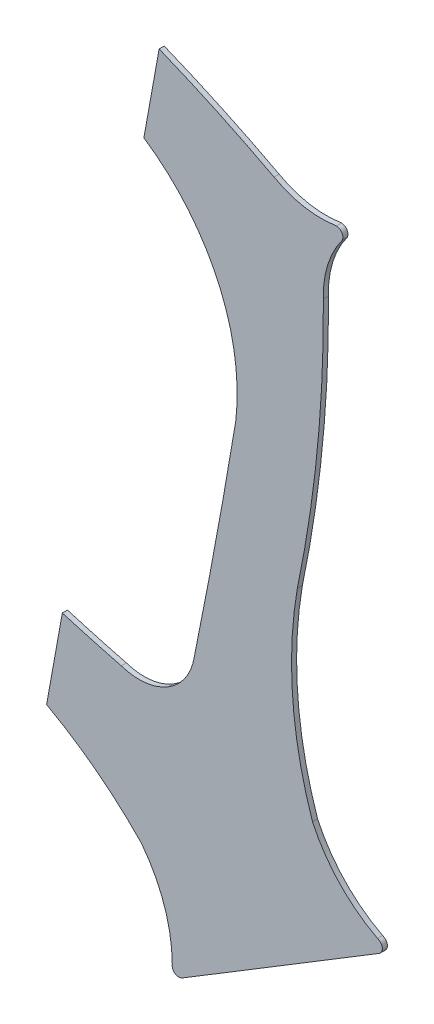
ISO-10303-21;
HEADER;
FILE_DESCRIPTION(('STEP AP214'),'2;1');
FILE_NAME('part.step','',(''),(''),'','','');
FILE_SCHEMA(('AUTOMOTIVE_DESIGN { 1 0 10303 214 1 1 1 1 }'));
ENDSEC;
DATA;
#1=APPLICATION_CONTEXT('core data for automotive mechanical design processes');
#2=APPLICATION_PROTOCOL_DEFINITION('international standard','automotive_design',2000,#1);
#3=PRODUCT_CONTEXT('',#1,'mechanical');
#4=PRODUCT('Part','Part','',(#3));
#5=PRODUCT_RELATED_PRODUCT_CATEGORY('part','',(#4));
#6=PRODUCT_DEFINITION_FORMATION('','',#4);
#7=PRODUCT_DEFINITION_CONTEXT('part definition',#1,'design');
#8=PRODUCT_DEFINITION('design','',#6,#7);
#9=PRODUCT_DEFINITION_SHAPE('','',#8);
#10=(LENGTH_UNIT() NAMED_UNIT(*) SI_UNIT(.MILLI.,.METRE.));
#11=(NAMED_UNIT(*) PLANE_ANGLE_UNIT() SI_UNIT($,.RADIAN.));
#12=(NAMED_UNIT(*) SI_UNIT($,.STERADIAN.) SOLID_ANGLE_UNIT());
#13=UNCERTAINTY_MEASURE_WITH_UNIT(LENGTH_MEASURE(1.E-05),#10,'distance_accuracy_value','');
#14=(GEOMETRIC_REPRESENTATION_CONTEXT(3) GLOBAL_UNCERTAINTY_ASSIGNED_CONTEXT((#13)) GLOBAL_UNIT_ASSIGNED_CONTEXT((#10,
#11,#12)) REPRESENTATION_CONTEXT('',''));
#15=CARTESIAN_POINT('',(0.,0.,0.));
#16=DIRECTION('',(0.,0.,1.));
#17=DIRECTION('',(1.,0.,0.));
#18=AXIS2_PLACEMENT_3D('',#15,#16,#17);
#19=CARTESIAN_POINT('',(281.954590354069,-637.701637012419,0.));
#20=DIRECTION('',(-0.984127859750687,0.177460856705166,0.));
#21=DIRECTION('',(0.177460856705166,0.984127859750688,0.));
#22=AXIS2_PLACEMENT_3D('',#19,#20,#21);
#23=PLANE('',#22);
#24=DIRECTION('',(-0.177460856705166,-0.984127859750688,0.));
#25=VECTOR('',#24,1.);
#26=CARTESIAN_POINT('',(124.848478327971,-1508.95011767804,6.35));
#27=LINE('',#26,#25);
#28=CARTESIAN_POINT('',(486.974549257167,499.258124748981,6.35));
#29=VERTEX_POINT('',#28);
#30=CARTESIAN_POINT('',(467.913163683421,393.55120471681,6.35));
#31=VERTEX_POINT('',#30);
#32=EDGE_CURVE('E201',#29,#31,#27,.T.);
#33=ORIENTED_EDGE('',*,*,#32,.F.);
#34=DIRECTION('',(0.,0.,-1.));
#35=VECTOR('',#34,1.);
#36=CARTESIAN_POINT('',(486.974549257167,499.258124748981,6.35));
#37=LINE('',#36,#35);
#38=CARTESIAN_POINT('',(486.974549257167,499.258124748981,0.));
#39=VERTEX_POINT('',#38);
#40=EDGE_CURVE('E336',#29,#39,#37,.T.);
#41=ORIENTED_EDGE('',*,*,#40,.T.);
#42=DIRECTION('',(-0.177460856705166,-0.984127859750688,0.));
#43=VECTOR('',#42,1.);
#44=CARTESIAN_POINT('',(124.848478327971,-1508.95011767804,0.));
#45=LINE('',#44,#43);
#46=CARTESIAN_POINT('',(467.913163683421,393.55120471681,0.));
#47=VERTEX_POINT('',#46);
#48=EDGE_CURVE('E46',#39,#47,#45,.T.);
#49=ORIENTED_EDGE('',*,*,#48,.T.);
#50=DIRECTION('',(0.,0.,-1.));
#51=VECTOR('',#50,1.);
#52=CARTESIAN_POINT('',(467.913163683421,393.55120471681,6.35));
#53=LINE('',#52,#51);
#54=EDGE_CURVE('E335',#31,#47,#53,.T.);
#55=ORIENTED_EDGE('',*,*,#54,.F.);
#56=EDGE_LOOP('',(#33,#41,#49,#55));
#57=FACE_BOUND('',#56,.T.);
#58=ADVANCED_FACE('F38',(#57),#23,.T.);
#59=DIRECTION('',(0.,0.,-1.));
#60=VECTOR('',#59,1.);
#61=CARTESIAN_POINT('',(346.38431386247,-280.399823655375,6.35));
#62=LINE('',#61,#60);
#63=CARTESIAN_POINT('',(346.38431386247,-280.399823655375,6.35));
#64=VERTEX_POINT('',#63);
#65=CARTESIAN_POINT('',(346.38431386247,-280.399823655375,0.));
#66=VERTEX_POINT('',#65);
#67=EDGE_CURVE('E41',#64,#66,#62,.T.);
#68=ORIENTED_EDGE('',*,*,#67,.F.);
#69=CARTESIAN_POINT('',(366.028712193128,-171.459745013918,6.35));
#70=VERTEX_POINT('',#69);
#71=EDGE_CURVE('E322',#70,#64,#27,.T.);
#72=ORIENTED_EDGE('',*,*,#71,.F.);
#73=DIRECTION('',(0.,0.,-1.));
#74=VECTOR('',#73,1.);
#75=CARTESIAN_POINT('',(366.028712193128,-171.459745013918,6.35));
#76=LINE('',#75,#74);
#77=CARTESIAN_POINT('',(366.028712193128,-171.459745013918,0.));
#78=VERTEX_POINT('',#77);
#79=EDGE_CURVE('E333',#78,#70,#76,.F.);
#80=ORIENTED_EDGE('',*,*,#79,.F.);
#81=EDGE_CURVE('E11',#78,#66,#45,.T.);
#82=ORIENTED_EDGE('',*,*,#81,.T.);
#83=EDGE_LOOP('',(#68,#72,#80,#82));
#84=FACE_BOUND('',#83,.T.);
#85=ADVANCED_FACE('F349',(#84),#23,.T.);
#86=CARTESIAN_POINT('',(321.271822120409,175.360684015611,6.35));
#87=DIRECTION('',(0.,0.,-1.));
#88=DIRECTION('',(-1.,0.,0.));
#89=AXIS2_PLACEMENT_3D('',#86,#87,#88);
#90=CYLINDRICAL_SURFACE('',#89,262.889304421576);
#91=CARTESIAN_POINT('',(321.271822120409,175.360684015611,6.35));
#92=DIRECTION('',(0.,0.,1.));
#93=DIRECTION('',(1.,0.,0.));
#94=AXIS2_PLACEMENT_3D('',#91,#92,#93);
#95=CIRCLE('',#94,262.889304421576);
#96=CARTESIAN_POINT('',(546.059308022838,311.674192373828,6.35));
#97=VERTEX_POINT('',#96);
#98=EDGE_CURVE('E187',#97,#31,#95,.T.);
#99=ORIENTED_EDGE('',*,*,#98,.T.);
#100=ORIENTED_EDGE('',*,*,#54,.T.);
#101=CARTESIAN_POINT('',(321.271822120409,175.360684015611,0.));
#102=DIRECTION('',(0.,0.,1.));
#103=DIRECTION('',(1.,0.,0.));
#104=AXIS2_PLACEMENT_3D('',#101,#102,#103);
#105=CIRCLE('',#104,262.889304421576);
#106=CARTESIAN_POINT('',(546.059308022838,311.674192373828,0.));
#107=VERTEX_POINT('',#106);
#108=EDGE_CURVE('E62',#107,#47,#105,.T.);
#109=ORIENTED_EDGE('',*,*,#108,.F.);
#110=DIRECTION('',(0.,0.,-1.));
#111=VECTOR('',#110,1.);
#112=CARTESIAN_POINT('',(546.059308022838,311.674192373828,6.35));
#113=LINE('',#112,#111);
#114=EDGE_CURVE('E184',#97,#107,#113,.T.);
#115=ORIENTED_EDGE('',*,*,#114,.F.);
#116=EDGE_LOOP('',(#99,#100,#109,#115));
#117=FACE_BOUND('',#116,.T.);
#118=ADVANCED_FACE('F186',(#117),#90,.F.);
#119=CARTESIAN_POINT('',(321.58777857859,174.841013472558,6.35));
#120=DIRECTION('',(0.,0.,-1.));
#121=DIRECTION('',(-1.,0.,0.));
#122=AXIS2_PLACEMENT_3D('',#119,#120,#121);
#123=CYLINDRICAL_SURFACE('',#122,262.889304421582);
#124=CARTESIAN_POINT('',(321.58777857859,174.841013472558,0.));
#125=DIRECTION('',(0.,0.,1.));
#126=DIRECTION('',(1.,0.,0.));
#127=AXIS2_PLACEMENT_3D('',#124,#125,#126);
#128=CIRCLE('',#127,262.889304421582);
#129=CARTESIAN_POINT('',(582.702987751098,144.351114849231,0.));
#130=VERTEX_POINT('',#129);
#131=EDGE_CURVE('E253',#130,#107,#128,.T.);
#132=ORIENTED_EDGE('',*,*,#131,.F.);
#133=DIRECTION('',(0.,0.,-1.));
#134=VECTOR('',#133,1.);
#135=CARTESIAN_POINT('',(582.702987751098,144.351114849231,6.35));
#136=LINE('',#135,#134);
#137=CARTESIAN_POINT('',(582.702987751098,144.351114849231,6.35));
#138=VERTEX_POINT('',#137);
#139=EDGE_CURVE('E192',#138,#130,#136,.T.);
#140=ORIENTED_EDGE('',*,*,#139,.F.);
#141=CARTESIAN_POINT('',(321.58777857859,174.841013472558,6.35));
#142=DIRECTION('',(0.,0.,1.));
#143=DIRECTION('',(1.,0.,0.));
#144=AXIS2_PLACEMENT_3D('',#141,#142,#143);
#145=CIRCLE('',#144,262.889304421582);
#146=EDGE_CURVE('E199',#138,#97,#145,.T.);
#147=ORIENTED_EDGE('',*,*,#146,.T.);
#148=ORIENTED_EDGE('',*,*,#114,.T.);
#149=EDGE_LOOP('',(#132,#140,#147,#148));
#150=FACE_BOUND('',#149,.T.);
#151=ADVANCED_FACE('F205',(#150),#123,.F.);
#152=CARTESIAN_POINT('',(-7166.0223936227,1428.99548774319,6.35));
#153=DIRECTION('',(0.,0.,-1.));
#154=DIRECTION('',(-1.,0.,0.));
#155=AXIS2_PLACEMENT_3D('',#152,#153,#154);
#156=CYLINDRICAL_SURFACE('',#155,7854.4927398754);
#157=CARTESIAN_POINT('',(-7166.0223936227,1428.99548774319,0.));
#158=DIRECTION('',(0.,0.,1.));
#159=DIRECTION('',(1.,0.,0.));
#160=AXIS2_PLACEMENT_3D('',#157,#158,#159);
#161=CIRCLE('',#160,7854.4927398754);
#162=CARTESIAN_POINT('',(530.91435464062,-136.322656913046,0.));
#163=VERTEX_POINT('',#162);
#164=EDGE_CURVE('E255',#163,#130,#161,.T.);
#165=ORIENTED_EDGE('',*,*,#164,.F.);
#166=DIRECTION('',(0.,0.,-1.));
#167=VECTOR('',#166,1.);
#168=CARTESIAN_POINT('',(530.91435464062,-136.322656913046,6.35));
#169=LINE('',#168,#167);
#170=CARTESIAN_POINT('',(530.91435464062,-136.322656913046,6.35));
#171=VERTEX_POINT('',#170);
#172=EDGE_CURVE('E328',#171,#163,#169,.T.);
#173=ORIENTED_EDGE('',*,*,#172,.F.);
#174=CARTESIAN_POINT('',(-7166.0223936227,1428.99548774319,6.35));
#175=DIRECTION('',(0.,0.,1.));
#176=DIRECTION('',(1.,0.,0.));
#177=AXIS2_PLACEMENT_3D('',#174,#175,#176);
#178=CIRCLE('',#177,7854.4927398754);
#179=EDGE_CURVE('E206',#171,#138,#178,.T.);
#180=ORIENTED_EDGE('',*,*,#179,.T.);
#181=ORIENTED_EDGE('',*,*,#139,.T.);
#182=EDGE_LOOP('',(#165,#173,#180,#181));
#183=FACE_BOUND('',#182,.T.);
#184=ADVANCED_FACE('F375',(#183),#156,.F.);
#185=CARTESIAN_POINT('',(462.115824234645,-125.848637980314,6.35));
#186=DIRECTION('',(0.,0.,-1.));
#187=DIRECTION('',(-1.,0.,0.));
#188=AXIS2_PLACEMENT_3D('',#185,#186,#187);
#189=CYLINDRICAL_SURFACE('',#188,69.5912556189722);
#190=CARTESIAN_POINT('',(462.115824234645,-125.848637980314,0.));
#191=DIRECTION('',(0.,0.,1.));
#192=DIRECTION('',(1.,0.,0.));
#193=AXIS2_PLACEMENT_3D('',#190,#191,#192);
#194=CIRCLE('',#193,69.5912556189722);
#195=CARTESIAN_POINT('',(498.269127795964,-185.311916566584,0.));
#196=VERTEX_POINT('',#195);
#197=EDGE_CURVE('E258',#196,#163,#194,.T.);
#198=ORIENTED_EDGE('',*,*,#197,.F.);
#199=DIRECTION('',(0.,0.,-1.));
#200=VECTOR('',#199,1.);
#201=CARTESIAN_POINT('',(498.269127795964,-185.311916566584,6.35));
#202=LINE('',#201,#200);
#203=CARTESIAN_POINT('',(498.269127795964,-185.311916566584,6.35));
#204=VERTEX_POINT('',#203);
#205=EDGE_CURVE('E326',#204,#196,#202,.T.);
#206=ORIENTED_EDGE('',*,*,#205,.F.);
#207=CARTESIAN_POINT('',(462.115824234645,-125.848637980314,6.35));
#208=DIRECTION('',(0.,0.,1.));
#209=DIRECTION('',(1.,0.,0.));
#210=AXIS2_PLACEMENT_3D('',#207,#208,#209);
#211=CIRCLE('',#210,69.5912556189722);
#212=EDGE_CURVE('E208',#204,#171,#211,.T.);
#213=ORIENTED_EDGE('',*,*,#212,.T.);
#214=ORIENTED_EDGE('',*,*,#172,.T.);
#215=EDGE_LOOP('',(#198,#206,#213,#214));
#216=FACE_BOUND('',#215,.T.);
#217=ADVANCED_FACE('F372',(#216),#189,.F.);
#218=CARTESIAN_POINT('',(-482.450043904599,-781.583074693866,6.35));
#219=DIRECTION('',(0.519509287319665,-0.854464803481462,0.));
#220=DIRECTION('',(0.854464803481462,0.519509287319666,0.));
#221=AXIS2_PLACEMENT_3D('',#218,#219,#220);
#222=PLANE('',#221);
#223=DIRECTION('',(-0.854464803481462,-0.519509287319665,0.));
#224=VECTOR('',#223,1.);
#225=CARTESIAN_POINT('',(-482.450043904599,-781.583074693866,0.));
#226=LINE('',#225,#224);
#227=CARTESIAN_POINT('',(498.193534098557,-185.357877064554,0.));
#228=VERTEX_POINT('',#227);
#229=EDGE_CURVE('E261',#196,#228,#226,.T.);
#230=ORIENTED_EDGE('',*,*,#229,.T.);
#231=DIRECTION('',(0.,0.,-1.));
#232=VECTOR('',#231,1.);
#233=CARTESIAN_POINT('',(498.193534098557,-185.357877064554,6.35));
#234=LINE('',#233,#232);
#235=CARTESIAN_POINT('',(498.193534098557,-185.357877064554,6.35));
#236=VERTEX_POINT('',#235);
#237=EDGE_CURVE('E324',#236,#228,#234,.T.);
#238=ORIENTED_EDGE('',*,*,#237,.F.);
#239=DIRECTION('',(-0.854464803481462,-0.519509287319665,0.));
#240=VECTOR('',#239,1.);
#241=CARTESIAN_POINT('',(-482.450043904599,-781.583074693866,6.35));
#242=LINE('',#241,#240);
#243=EDGE_CURVE('E213',#204,#236,#242,.T.);
#244=ORIENTED_EDGE('',*,*,#243,.F.);
#245=ORIENTED_EDGE('',*,*,#205,.T.);
#246=EDGE_LOOP('',(#230,#238,#244,#245));
#247=FACE_BOUND('',#246,.T.);
#248=ADVANCED_FACE('F368',(#247),#222,.F.);
#249=CARTESIAN_POINT('',(462.04023053727,-125.894598478334,6.35));
#250=DIRECTION('',(0.,0.,-1.));
#251=DIRECTION('',(-1.,0.,0.));
#252=AXIS2_PLACEMENT_3D('',#249,#250,#251);
#253=CYLINDRICAL_SURFACE('',#252,69.5912556189128);
#254=CARTESIAN_POINT('',(462.04023053727,-125.894598478334,0.));
#255=DIRECTION('',(0.,0.,1.));
#256=DIRECTION('',(1.,0.,0.));
#257=AXIS2_PLACEMENT_3D('',#254,#255,#256);
#258=CIRCLE('',#257,69.5912556189128);
#259=CARTESIAN_POINT('',(439.676641258821,-191.794619215825,0.));
#260=VERTEX_POINT('',#259);
#261=EDGE_CURVE('E264',#260,#228,#258,.T.);
#262=ORIENTED_EDGE('',*,*,#261,.F.);
#263=DIRECTION('',(0.,0.,-1.));
#264=VECTOR('',#263,1.);
#265=CARTESIAN_POINT('',(439.676641258821,-191.794619215825,6.35));
#266=LINE('',#265,#264);
#267=CARTESIAN_POINT('',(439.676641258821,-191.794619215825,6.35));
#268=VERTEX_POINT('',#267);
#269=EDGE_CURVE('E251',#268,#260,#266,.T.);
#270=ORIENTED_EDGE('',*,*,#269,.F.);
#271=CARTESIAN_POINT('',(462.04023053727,-125.894598478334,6.35));
#272=DIRECTION('',(0.,0.,1.));
#273=DIRECTION('',(1.,0.,0.));
#274=AXIS2_PLACEMENT_3D('',#271,#272,#273);
#275=CIRCLE('',#274,69.5912556189128);
#276=EDGE_CURVE('E215',#268,#236,#275,.T.);
#277=ORIENTED_EDGE('',*,*,#276,.T.);
#278=ORIENTED_EDGE('',*,*,#237,.T.);
#279=EDGE_LOOP('',(#262,#270,#277,#278));
#280=FACE_BOUND('',#279,.T.);
#281=ADVANCED_FACE('F363',(#280),#253,.F.);
#282=CARTESIAN_POINT('',(913.079353349683,1666.28875354813,6.35));
#283=DIRECTION('',(0.,0.,-1.));
#284=DIRECTION('',(-1.,0.,0.));
#285=AXIS2_PLACEMENT_3D('',#282,#283,#284);
#286=CYLINDRICAL_SURFACE('',#285,1917.44203248934);
#287=CARTESIAN_POINT('',(913.079353349683,1666.28875354813,0.));
#288=DIRECTION('',(0.,0.,1.));
#289=DIRECTION('',(1.,0.,0.));
#290=AXIS2_PLACEMENT_3D('',#287,#288,#289);
#291=CIRCLE('',#290,1917.44203248934);
#292=EDGE_CURVE('E54',#78,#260,#291,.T.);
#293=ORIENTED_EDGE('',*,*,#292,.F.);
#294=ORIENTED_EDGE('',*,*,#79,.T.);
#295=CARTESIAN_POINT('',(913.079353349683,1666.28875354813,6.35));
#296=DIRECTION('',(0.,0.,1.));
#297=DIRECTION('',(1.,0.,0.));
#298=AXIS2_PLACEMENT_3D('',#295,#296,#297);
#299=CIRCLE('',#298,1917.44203248934);
#300=EDGE_CURVE('E218',#70,#268,#299,.T.);
#301=ORIENTED_EDGE('',*,*,#300,.T.);
#302=ORIENTED_EDGE('',*,*,#269,.T.);
#303=EDGE_LOOP('',(#293,#294,#301,#302));
#304=FACE_BOUND('',#303,.T.);
#305=ADVANCED_FACE('F359',(#304),#286,.F.);
#306=CARTESIAN_POINT('',(108.423517049824,-713.458443864965,6.35));
#307=DIRECTION('',(0.,0.,-1.));
#308=DIRECTION('',(-1.,0.,0.));
#309=AXIS2_PLACEMENT_3D('',#306,#307,#308);
#310=CYLINDRICAL_SURFACE('',#309,494.130660207949);
#311=CARTESIAN_POINT('',(108.423517049824,-713.458443864965,6.35));
#312=DIRECTION('',(0.,0.,1.));
#313=DIRECTION('',(1.,0.,0.));
#314=AXIS2_PLACEMENT_3D('',#311,#312,#313);
#315=CIRCLE('',#314,494.130660207949);
#316=CARTESIAN_POINT('',(464.777855722106,-371.14762798703,6.35));
#317=VERTEX_POINT('',#316);
#318=EDGE_CURVE('E220',#317,#64,#315,.T.);
#319=ORIENTED_EDGE('',*,*,#318,.T.);
#320=ORIENTED_EDGE('',*,*,#67,.T.);
#321=CARTESIAN_POINT('',(108.423517049824,-713.458443864965,0.));
#322=DIRECTION('',(0.,0.,1.));
#323=DIRECTION('',(1.,0.,0.));
#324=AXIS2_PLACEMENT_3D('',#321,#322,#323);
#325=CIRCLE('',#324,494.130660207949);
#326=CARTESIAN_POINT('',(464.777855722106,-371.14762798703,0.));
#327=VERTEX_POINT('',#326);
#328=EDGE_CURVE('E268',#327,#66,#325,.T.);
#329=ORIENTED_EDGE('',*,*,#328,.F.);
#330=DIRECTION('',(0.,0.,-1.));
#331=VECTOR('',#330,1.);
#332=CARTESIAN_POINT('',(464.777855722106,-371.14762798703,6.35));
#333=LINE('',#332,#331);
#334=EDGE_CURVE('E320',#317,#327,#333,.T.);
#335=ORIENTED_EDGE('',*,*,#334,.F.);
#336=EDGE_LOOP('',(#319,#320,#329,#335));
#337=FACE_BOUND('',#336,.T.);
#338=ADVANCED_FACE('F345',(#337),#310,.F.);
#339=CARTESIAN_POINT('',(319.353222736049,-483.973147392643,6.35));
#340=DIRECTION('',(0.,0.,-1.));
#341=DIRECTION('',(-1.,0.,0.));
#342=AXIS2_PLACEMENT_3D('',#339,#340,#341);
#343=CYLINDRICAL_SURFACE('',#342,184.059560219717);
#344=CARTESIAN_POINT('',(319.353222736049,-483.973147392643,0.));
#345=DIRECTION('',(0.,0.,1.));
#346=DIRECTION('',(1.,0.,0.));
#347=AXIS2_PLACEMENT_3D('',#344,#345,#346);
#348=CIRCLE('',#347,184.059560219717);
#349=CARTESIAN_POINT('',(503.4084148677,-482.705094690028,0.));
#350=VERTEX_POINT('',#349);
#351=EDGE_CURVE('E270',#350,#327,#348,.T.);
#352=ORIENTED_EDGE('',*,*,#351,.F.);
#353=DIRECTION('',(0.,0.,-1.));
#354=VECTOR('',#353,1.);
#355=CARTESIAN_POINT('',(503.4084148677,-482.705094690028,6.35));
#356=LINE('',#355,#354);
#357=CARTESIAN_POINT('',(503.4084148677,-482.705094690028,6.35));
#358=VERTEX_POINT('',#357);
#359=EDGE_CURVE('E318',#358,#350,#356,.T.);
#360=ORIENTED_EDGE('',*,*,#359,.F.);
#361=CARTESIAN_POINT('',(319.353222736049,-483.973147392643,6.35));
#362=DIRECTION('',(0.,0.,1.));
#363=DIRECTION('',(1.,0.,0.));
#364=AXIS2_PLACEMENT_3D('',#361,#362,#363);
#365=CIRCLE('',#364,184.059560219717);
#366=EDGE_CURVE('E223',#358,#317,#365,.T.);
#367=ORIENTED_EDGE('',*,*,#366,.T.);
#368=ORIENTED_EDGE('',*,*,#334,.T.);
#369=EDGE_LOOP('',(#352,#360,#367,#368));
#370=FACE_BOUND('',#369,.T.);
#371=ADVANCED_FACE('F354',(#370),#343,.F.);
#372=CARTESIAN_POINT('',(511.646961985689,-484.251607923742,6.35));
#373=DIRECTION('',(0.,0.,-1.));
#374=DIRECTION('',(-1.,0.,0.));
#375=AXIS2_PLACEMENT_3D('',#372,#373,#374);
#376=CYLINDRICAL_SURFACE('',#375,8.38244366502871);
#377=CARTESIAN_POINT('',(511.646961985689,-484.251607923742,0.));
#378=DIRECTION('',(0.,0.,1.));
#379=DIRECTION('',(1.,0.,0.));
#380=AXIS2_PLACEMENT_3D('',#377,#378,#379);
#381=CIRCLE('',#380,8.38244366502871);
#382=CARTESIAN_POINT('',(516.001719314178,-491.41411100628,0.));
#383=VERTEX_POINT('',#382);
#384=EDGE_CURVE('E273',#350,#383,#381,.T.);
#385=ORIENTED_EDGE('',*,*,#384,.T.);
#386=DIRECTION('',(0.,0.,-1.));
#387=VECTOR('',#386,1.);
#388=CARTESIAN_POINT('',(516.001719314178,-491.41411100628,6.35));
#389=LINE('',#388,#387);
#390=CARTESIAN_POINT('',(516.001719314178,-491.41411100628,6.35));
#391=VERTEX_POINT('',#390);
#392=EDGE_CURVE('E316',#391,#383,#389,.T.);
#393=ORIENTED_EDGE('',*,*,#392,.F.);
#394=CARTESIAN_POINT('',(511.646961985689,-484.251607923742,6.35));
#395=DIRECTION('',(0.,0.,1.));
#396=DIRECTION('',(1.,0.,0.));
#397=AXIS2_PLACEMENT_3D('',#394,#395,#396);
#398=CIRCLE('',#397,8.38244366502871);
#399=EDGE_CURVE('E226',#358,#391,#398,.T.);
#400=ORIENTED_EDGE('',*,*,#399,.F.);
#401=ORIENTED_EDGE('',*,*,#359,.T.);
#402=EDGE_LOOP('',(#385,#393,#400,#401));
#403=FACE_BOUND('',#402,.T.);
#404=ADVANCED_FACE('F428',(#403),#376,.T.);
#405=CARTESIAN_POINT('',(-341.784697515792,-1012.94291761996,6.35));
#406=DIRECTION('',(0.519509286615978,-0.8544648039093,0.));
#407=DIRECTION('',(0.8544648039093,0.519509286615978,0.));
#408=AXIS2_PLACEMENT_3D('',#405,#406,#407);
#409=PLANE('',#408);
#410=DIRECTION('',(-0.8544648039093,-0.519509286615978,0.));
#411=VECTOR('',#410,1.);
#412=CARTESIAN_POINT('',(-341.784697515792,-1012.94291761996,0.));
#413=LINE('',#412,#411);
#414=CARTESIAN_POINT('',(761.791635197552,-341.975370786985,0.));
#415=VERTEX_POINT('',#414);
#416=EDGE_CURVE('E276',#415,#383,#413,.T.);
#417=ORIENTED_EDGE('',*,*,#416,.F.);
#418=DIRECTION('',(0.,0.,-1.));
#419=VECTOR('',#418,1.);
#420=CARTESIAN_POINT('',(761.791635197552,-341.975370786985,6.35));
#421=LINE('',#420,#419);
#422=CARTESIAN_POINT('',(761.791635197552,-341.975370786985,6.35));
#423=VERTEX_POINT('',#422);
#424=EDGE_CURVE('E314',#423,#415,#421,.T.);
#425=ORIENTED_EDGE('',*,*,#424,.F.);
#426=DIRECTION('',(-0.8544648039093,-0.519509286615978,0.));
#427=VECTOR('',#426,1.);
#428=CARTESIAN_POINT('',(-341.784697515792,-1012.94291761996,6.35));
#429=LINE('',#428,#427);
#430=EDGE_CURVE('E228',#423,#391,#429,.T.);
#431=ORIENTED_EDGE('',*,*,#430,.T.);
#432=ORIENTED_EDGE('',*,*,#392,.T.);
#433=EDGE_LOOP('',(#417,#425,#431,#432));
#434=FACE_BOUND('',#433,.T.);
#435=ADVANCED_FACE('F423',(#434),#409,.T.);
#436=CARTESIAN_POINT('',(757.436877869032,-334.812867704465,6.35));
#437=DIRECTION('',(0.,0.,-1.));
#438=DIRECTION('',(-1.,0.,0.));
#439=AXIS2_PLACEMENT_3D('',#436,#437,#438);
#440=CYLINDRICAL_SURFACE('',#439,8.38244366502922);
#441=CARTESIAN_POINT('',(757.436877869032,-334.812867704465,0.));
#442=DIRECTION('',(0.,0.,1.));
#443=DIRECTION('',(1.,0.,0.));
#444=AXIS2_PLACEMENT_3D('',#441,#442,#443);
#445=CIRCLE('',#444,8.38244366502922);
#446=CARTESIAN_POINT('',(759.855421815445,-326.786909383077,0.));
#447=VERTEX_POINT('',#446);
#448=EDGE_CURVE('E279',#415,#447,#445,.T.);
#449=ORIENTED_EDGE('',*,*,#448,.T.);
#450=DIRECTION('',(0.,0.,-1.));
#451=VECTOR('',#450,1.);
#452=CARTESIAN_POINT('',(759.855421815445,-326.786909383077,6.35));
#453=LINE('',#452,#451);
#454=CARTESIAN_POINT('',(759.855421815445,-326.786909383077,6.35));
#455=VERTEX_POINT('',#454);
#456=EDGE_CURVE('E312',#455,#447,#453,.T.);
#457=ORIENTED_EDGE('',*,*,#456,.F.);
#458=CARTESIAN_POINT('',(757.436877869032,-334.812867704465,6.35));
#459=DIRECTION('',(0.,0.,1.));
#460=DIRECTION('',(1.,0.,0.));
#461=AXIS2_PLACEMENT_3D('',#458,#459,#460);
#462=CIRCLE('',#461,8.38244366502922);
#463=EDGE_CURVE('E231',#423,#455,#462,.T.);
#464=ORIENTED_EDGE('',*,*,#463,.F.);
#465=ORIENTED_EDGE('',*,*,#424,.T.);
#466=EDGE_LOOP('',(#449,#457,#464,#465));
#467=FACE_BOUND('',#466,.T.);
#468=ADVANCED_FACE('F429',(#467),#440,.T.);
#469=CARTESIAN_POINT('',(845.687122839453,-163.965409550889,6.35));
#470=DIRECTION('',(0.,0.,-1.));
#471=DIRECTION('',(-1.,0.,0.));
#472=AXIS2_PLACEMENT_3D('',#469,#470,#471);
#473=CYLINDRICAL_SURFACE('',#472,184.059560219724);
#474=CARTESIAN_POINT('',(845.687122839453,-163.965409550889,0.));
#475=DIRECTION('',(0.,0.,1.));
#476=DIRECTION('',(1.,0.,0.));
#477=AXIS2_PLACEMENT_3D('',#474,#475,#476);
#478=CIRCLE('',#477,184.059560219724);
#479=CARTESIAN_POINT('',(678.592730983278,-241.149513604075,0.));
#480=VERTEX_POINT('',#479);
#481=EDGE_CURVE('E282',#480,#447,#478,.T.);
#482=ORIENTED_EDGE('',*,*,#481,.F.);
#483=DIRECTION('',(0.,0.,-1.));
#484=VECTOR('',#483,1.);
#485=CARTESIAN_POINT('',(678.592730983278,-241.149513604075,6.35));
#486=LINE('',#485,#484);
#487=CARTESIAN_POINT('',(678.592730983278,-241.149513604075,6.35));
#488=VERTEX_POINT('',#487);
#489=EDGE_CURVE('E310',#488,#480,#486,.T.);
#490=ORIENTED_EDGE('',*,*,#489,.F.);
#491=CARTESIAN_POINT('',(845.687122839453,-163.965409550889,6.35));
#492=DIRECTION('',(0.,0.,1.));
#493=DIRECTION('',(1.,0.,0.));
#494=AXIS2_PLACEMENT_3D('',#491,#492,#493);
#495=CIRCLE('',#494,184.059560219724);
#496=EDGE_CURVE('E233',#488,#455,#495,.T.);
#497=ORIENTED_EDGE('',*,*,#496,.T.);
#498=ORIENTED_EDGE('',*,*,#456,.T.);
#499=EDGE_LOOP('',(#482,#490,#497,#498));
#500=FACE_BOUND('',#499,.T.);
#501=ADVANCED_FACE('F417',(#500),#473,.F.);
#502=CARTESIAN_POINT('',(1146.49938271529,-82.314773630773,6.35));
#503=DIRECTION('',(0.,0.,-1.));
#504=DIRECTION('',(-1.,0.,0.));
#505=AXIS2_PLACEMENT_3D('',#502,#503,#504);
#506=CYLINDRICAL_SURFACE('',#505,494.130660207846);
#507=CARTESIAN_POINT('',(1146.49938271529,-82.314773630773,0.));
#508=DIRECTION('',(0.,0.,1.));
#509=DIRECTION('',(1.,0.,0.));
#510=AXIS2_PLACEMENT_3D('',#507,#508,#509);
#511=CIRCLE('',#510,494.130660207846);
#512=CARTESIAN_POINT('',(659.589207065077,1.84929355774532,0.));
#513=VERTEX_POINT('',#512);
#514=EDGE_CURVE('E285',#513,#480,#511,.T.);
#515=ORIENTED_EDGE('',*,*,#514,.F.);
#516=DIRECTION('',(0.,0.,-1.));
#517=VECTOR('',#516,1.);
#518=CARTESIAN_POINT('',(659.589207065077,1.84929355774532,6.35));
#519=LINE('',#518,#517);
#520=CARTESIAN_POINT('',(659.589207065077,1.84929355774532,6.35));
#521=VERTEX_POINT('',#520);
#522=EDGE_CURVE('E308',#521,#513,#519,.T.);
#523=ORIENTED_EDGE('',*,*,#522,.F.);
#524=CARTESIAN_POINT('',(1146.49938271529,-82.314773630773,6.35));
#525=DIRECTION('',(0.,0.,1.));
#526=DIRECTION('',(1.,0.,0.));
#527=AXIS2_PLACEMENT_3D('',#524,#525,#526);
#528=CIRCLE('',#527,494.130660207846);
#529=EDGE_CURVE('E236',#521,#488,#528,.T.);
#530=ORIENTED_EDGE('',*,*,#529,.T.);
#531=ORIENTED_EDGE('',*,*,#489,.T.);
#532=EDGE_LOOP('',(#515,#523,#530,#531));
#533=FACE_BOUND('',#532,.T.);
#534=ADVANCED_FACE('F412',(#533),#506,.F.);
#535=CARTESIAN_POINT('',(-850.577849984249,317.25610463602,6.35));
#536=DIRECTION('',(0.,0.,-1.));
#537=DIRECTION('',(-1.,0.,0.));
#538=AXIS2_PLACEMENT_3D('',#535,#536,#537);
#539=CYLINDRICAL_SURFACE('',#538,1542.75273348375);
#540=CARTESIAN_POINT('',(-850.577849984249,317.25610463602,0.));
#541=DIRECTION('',(0.,0.,1.));
#542=DIRECTION('',(1.,0.,0.));
#543=AXIS2_PLACEMENT_3D('',#540,#541,#542);
#544=CIRCLE('',#543,1542.75273348375);
#545=CARTESIAN_POINT('',(692.1119413343,331.191829702262,0.));
#546=VERTEX_POINT('',#545);
#547=EDGE_CURVE('E288',#513,#546,#544,.T.);
#548=ORIENTED_EDGE('',*,*,#547,.T.);
#549=DIRECTION('',(0.,0.,-1.));
#550=VECTOR('',#549,1.);
#551=CARTESIAN_POINT('',(692.1119413343,331.191829702262,6.35));
#552=LINE('',#551,#550);
#553=CARTESIAN_POINT('',(692.1119413343,331.191829702262,6.35));
#554=VERTEX_POINT('',#553);
#555=EDGE_CURVE('E306',#554,#546,#552,.T.);
#556=ORIENTED_EDGE('',*,*,#555,.F.);
#557=CARTESIAN_POINT('',(-850.577849984249,317.25610463602,6.35));
#558=DIRECTION('',(0.,0.,1.));
#559=DIRECTION('',(1.,0.,0.));
#560=AXIS2_PLACEMENT_3D('',#557,#558,#559);
#561=CIRCLE('',#560,1542.75273348375);
#562=EDGE_CURVE('E239',#521,#554,#561,.T.);
#563=ORIENTED_EDGE('',*,*,#562,.F.);
#564=ORIENTED_EDGE('',*,*,#522,.T.);
#565=EDGE_LOOP('',(#548,#556,#563,#564));
#566=FACE_BOUND('',#565,.T.);
#567=ADVANCED_FACE('F409',(#566),#539,.T.);
#568=CARTESIAN_POINT('',(812.65195135613,334.924075965147,6.35));
#569=DIRECTION('',(0.,0.,-1.));
#570=DIRECTION('',(-1.,0.,0.));
#571=AXIS2_PLACEMENT_3D('',#568,#569,#570);
#572=CYLINDRICAL_SURFACE('',#571,120.59777642324);
#573=CARTESIAN_POINT('',(812.65195135613,334.924075965147,0.));
#574=DIRECTION('',(0.,0.,1.));
#575=DIRECTION('',(1.,0.,0.));
#576=AXIS2_PLACEMENT_3D('',#573,#574,#575);
#577=CIRCLE('',#576,120.59777642324);
#578=CARTESIAN_POINT('',(715.802449376205,406.78503646854,0.));
#579=VERTEX_POINT('',#578);
#580=EDGE_CURVE('E291',#579,#546,#577,.T.);
#581=ORIENTED_EDGE('',*,*,#580,.F.);
#582=DIRECTION('',(0.,0.,-1.));
#583=VECTOR('',#582,1.);
#584=CARTESIAN_POINT('',(715.802449376205,406.78503646854,6.35));
#585=LINE('',#584,#583);
#586=CARTESIAN_POINT('',(715.802449376205,406.78503646854,6.35));
#587=VERTEX_POINT('',#586);
#588=EDGE_CURVE('E304',#587,#579,#585,.T.);
#589=ORIENTED_EDGE('',*,*,#588,.F.);
#590=CARTESIAN_POINT('',(812.65195135613,334.924075965147,6.35));
#591=DIRECTION('',(0.,0.,1.));
#592=DIRECTION('',(1.,0.,0.));
#593=AXIS2_PLACEMENT_3D('',#590,#591,#592);
#594=CIRCLE('',#593,120.59777642324);
#595=EDGE_CURVE('E241',#587,#554,#594,.T.);
#596=ORIENTED_EDGE('',*,*,#595,.T.);
#597=ORIENTED_EDGE('',*,*,#555,.T.);
#598=EDGE_LOOP('',(#581,#589,#596,#597));
#599=FACE_BOUND('',#598,.T.);
#600=ADVANCED_FACE('F405',(#599),#572,.F.);
#601=CARTESIAN_POINT('',(708.161102827378,410.231075458218,6.35));
#602=DIRECTION('',(0.,0.,-1.));
#603=DIRECTION('',(-1.,0.,0.));
#604=AXIS2_PLACEMENT_3D('',#601,#602,#603);
#605=CYLINDRICAL_SURFACE('',#604,8.38244366504419);
#606=CARTESIAN_POINT('',(708.161102827378,410.231075458218,0.));
#607=DIRECTION('',(0.,0.,1.));
#608=DIRECTION('',(1.,0.,0.));
#609=AXIS2_PLACEMENT_3D('',#606,#607,#608);
#610=CIRCLE('',#609,8.38244366504419);
#611=CARTESIAN_POINT('',(708.618394920768,418.601036374434,0.));
#612=VERTEX_POINT('',#611);
#613=EDGE_CURVE('E294',#579,#612,#610,.T.);
#614=ORIENTED_EDGE('',*,*,#613,.T.);
#615=DIRECTION('',(0.,0.,-1.));
#616=VECTOR('',#615,1.);
#617=CARTESIAN_POINT('',(708.618394920768,418.601036374434,6.35));
#618=LINE('',#617,#616);
#619=CARTESIAN_POINT('',(708.618394920768,418.601036374434,6.35));
#620=VERTEX_POINT('',#619);
#621=EDGE_CURVE('E302',#620,#612,#618,.T.);
#622=ORIENTED_EDGE('',*,*,#621,.F.);
#623=CARTESIAN_POINT('',(708.161102827378,410.231075458218,6.35));
#624=DIRECTION('',(0.,0.,1.));
#625=DIRECTION('',(1.,0.,0.));
#626=AXIS2_PLACEMENT_3D('',#623,#624,#625);
#627=CIRCLE('',#626,8.38244366504419);
#628=EDGE_CURVE('E244',#587,#620,#627,.T.);
#629=ORIENTED_EDGE('',*,*,#628,.F.);
#630=ORIENTED_EDGE('',*,*,#588,.T.);
#631=EDGE_LOOP('',(#614,#622,#629,#630));
#632=FACE_BOUND('',#631,.T.);
#633=ADVANCED_FACE('F523',(#632),#605,.T.);
#634=CARTESIAN_POINT('',(689.391986537946,537.656355024754,6.35));
#635=DIRECTION('',(0.,0.,-1.));
#636=DIRECTION('',(-1.,0.,0.));
#637=AXIS2_PLACEMENT_3D('',#634,#635,#636);
#638=CYLINDRICAL_SURFACE('',#637,120.597776423251);
#639=CARTESIAN_POINT('',(689.391986537946,537.656355024754,0.));
#640=DIRECTION('',(0.,0.,1.));
#641=DIRECTION('',(1.,0.,0.));
#642=AXIS2_PLACEMENT_3D('',#639,#640,#641);
#643=CIRCLE('',#642,120.597776423251);
#644=CARTESIAN_POINT('',(630.603532596765,432.358010491528,0.));
#645=VERTEX_POINT('',#644);
#646=EDGE_CURVE('E297',#645,#612,#643,.T.);
#647=ORIENTED_EDGE('',*,*,#646,.F.);
#648=DIRECTION('',(0.,0.,-1.));
#649=VECTOR('',#648,1.);
#650=CARTESIAN_POINT('',(630.603532596765,432.358010491528,6.35));
#651=LINE('',#650,#649);
#652=CARTESIAN_POINT('',(630.603532596765,432.358010491528,6.35));
#653=VERTEX_POINT('',#652);
#654=EDGE_CURVE('E191',#653,#645,#651,.T.);
#655=ORIENTED_EDGE('',*,*,#654,.F.);
#656=CARTESIAN_POINT('',(689.391986537946,537.656355024754,6.35));
#657=DIRECTION('',(0.,0.,1.));
#658=DIRECTION('',(1.,0.,0.));
#659=AXIS2_PLACEMENT_3D('',#656,#657,#658);
#660=CIRCLE('',#659,120.597776423251);
#661=EDGE_CURVE('E246',#653,#620,#660,.T.);
#662=ORIENTED_EDGE('',*,*,#661,.T.);
#663=ORIENTED_EDGE('',*,*,#621,.T.);
#664=EDGE_LOOP('',(#647,#655,#662,#663));
#665=FACE_BOUND('',#664,.T.);
#666=ADVANCED_FACE('F399',(#665),#638,.F.);
#667=CARTESIAN_POINT('',(-91.7456787835533,-930.835891156297,6.35));
#668=DIRECTION('',(0.,0.,-1.));
#669=DIRECTION('',(-1.,0.,0.));
#670=AXIS2_PLACEMENT_3D('',#667,#668,#669);
#671=CYLINDRICAL_SURFACE('',#670,1542.75273348375);
#672=ORIENTED_EDGE('',*,*,#40,.F.);
#673=CARTESIAN_POINT('',(-91.7456787835533,-930.835891156297,6.35));
#674=DIRECTION('',(0.,0.,1.));
#675=DIRECTION('',(1.,0.,0.));
#676=AXIS2_PLACEMENT_3D('',#673,#674,#675);
#677=CIRCLE('',#676,1542.75273348375);
#678=EDGE_CURVE('E249',#653,#29,#677,.T.);
#679=ORIENTED_EDGE('',*,*,#678,.F.);
#680=ORIENTED_EDGE('',*,*,#654,.T.);
#681=CARTESIAN_POINT('',(-91.7456787835533,-930.835891156297,0.));
#682=DIRECTION('',(0.,0.,1.));
#683=DIRECTION('',(1.,0.,0.));
#684=AXIS2_PLACEMENT_3D('',#681,#682,#683);
#685=CIRCLE('',#684,1542.75273348375);
#686=EDGE_CURVE('E203',#645,#39,#685,.T.);
#687=ORIENTED_EDGE('',*,*,#686,.T.);
#688=EDGE_LOOP('',(#672,#679,#680,#687));
#689=FACE_BOUND('',#688,.T.);
#690=ADVANCED_FACE('F391',(#689),#671,.T.);
#691=CARTESIAN_POINT('',(-60.5405790775166,-1475.52021258494,0.));
#692=DIRECTION('',(0.,0.,1.));
#693=DIRECTION('',(1.,0.,0.));
#694=AXIS2_PLACEMENT_3D('',#691,#692,#693);
#695=PLANE('',#694);
#696=ORIENTED_EDGE('',*,*,#48,.F.);
#697=ORIENTED_EDGE('',*,*,#686,.F.);
#698=ORIENTED_EDGE('',*,*,#646,.T.);
#699=ORIENTED_EDGE('',*,*,#613,.F.);
#700=ORIENTED_EDGE('',*,*,#580,.T.);
#701=ORIENTED_EDGE('',*,*,#547,.F.);
#702=ORIENTED_EDGE('',*,*,#514,.T.);
#703=ORIENTED_EDGE('',*,*,#481,.T.);
#704=ORIENTED_EDGE('',*,*,#448,.F.);
#705=ORIENTED_EDGE('',*,*,#416,.T.);
#706=ORIENTED_EDGE('',*,*,#384,.F.);
#707=ORIENTED_EDGE('',*,*,#351,.T.);
#708=ORIENTED_EDGE('',*,*,#328,.T.);
#709=ORIENTED_EDGE('',*,*,#81,.F.);
#710=ORIENTED_EDGE('',*,*,#292,.T.);
#711=ORIENTED_EDGE('',*,*,#261,.T.);
#712=ORIENTED_EDGE('',*,*,#229,.F.);
#713=ORIENTED_EDGE('',*,*,#197,.T.);
#714=ORIENTED_EDGE('',*,*,#164,.T.);
#715=ORIENTED_EDGE('',*,*,#131,.T.);
#716=ORIENTED_EDGE('',*,*,#108,.T.);
#717=EDGE_LOOP('',(#696,#697,#698,#699,#700,#701,#702,#703,#704,#705,#706,#707,#708,#709,#710,
#711,#712,#713,#714,#715,#716));
#718=FACE_BOUND('',#717,.T.);
#719=ADVANCED_FACE('F350',(#718),#695,.F.);
#720=CARTESIAN_POINT('',(-60.5405790775166,-1475.52021258494,6.35));
#721=DIRECTION('',(0.,0.,1.));
#722=DIRECTION('',(1.,0.,0.));
#723=AXIS2_PLACEMENT_3D('',#720,#721,#722);
#724=PLANE('',#723);
#725=ORIENTED_EDGE('',*,*,#678,.T.);
#726=ORIENTED_EDGE('',*,*,#32,.T.);
#727=ORIENTED_EDGE('',*,*,#98,.F.);
#728=ORIENTED_EDGE('',*,*,#146,.F.);
#729=ORIENTED_EDGE('',*,*,#179,.F.);
#730=ORIENTED_EDGE('',*,*,#212,.F.);
#731=ORIENTED_EDGE('',*,*,#243,.T.);
#732=ORIENTED_EDGE('',*,*,#276,.F.);
#733=ORIENTED_EDGE('',*,*,#300,.F.);
#734=ORIENTED_EDGE('',*,*,#71,.T.);
#735=ORIENTED_EDGE('',*,*,#318,.F.);
#736=ORIENTED_EDGE('',*,*,#366,.F.);
#737=ORIENTED_EDGE('',*,*,#399,.T.);
#738=ORIENTED_EDGE('',*,*,#430,.F.);
#739=ORIENTED_EDGE('',*,*,#463,.T.);
#740=ORIENTED_EDGE('',*,*,#496,.F.);
#741=ORIENTED_EDGE('',*,*,#529,.F.);
#742=ORIENTED_EDGE('',*,*,#562,.T.);
#743=ORIENTED_EDGE('',*,*,#595,.F.);
#744=ORIENTED_EDGE('',*,*,#628,.T.);
#745=ORIENTED_EDGE('',*,*,#661,.F.);
#746=EDGE_LOOP('',(#725,#726,#727,#728,#729,#730,#731,#732,#733,#734,#735,#736,#737,#738,#739,
#740,#741,#742,#743,#744,#745));
#747=FACE_BOUND('',#746,.T.);
#748=ADVANCED_FACE('F197',(#747),#724,.T.);
#749=CLOSED_SHELL('',(#58,#85,#118,#151,#184,#217,#248,#281,#305,#338,#371,#404,#435,#468,#501,
#534,#567,#600,#633,#666,#690,#719,#748));
#750=MANIFOLD_SOLID_BREP('B2',#749);
#751=ADVANCED_BREP_SHAPE_REPRESENTATION('',(#18,#750),#14);
#752=SHAPE_DEFINITION_REPRESENTATION(#9,#751);
ENDSEC;
END-ISO-10303-21;
